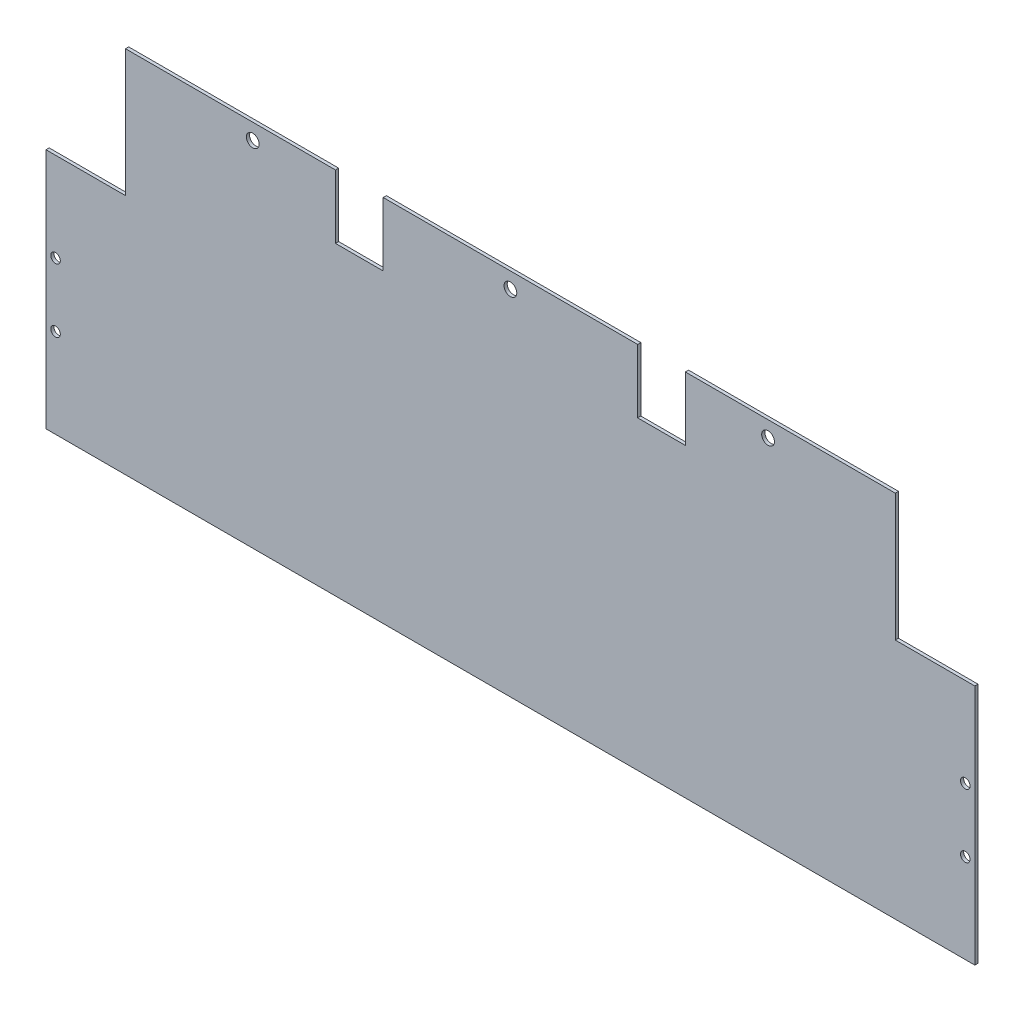
ISO-10303-21;
HEADER;
FILE_DESCRIPTION(('STEP AP214'),'2;1');
FILE_NAME('part.step','',(''),(''),'','','');
FILE_SCHEMA(('AUTOMOTIVE_DESIGN { 1 0 10303 214 1 1 1 1 }'));
ENDSEC;
DATA;
#1=APPLICATION_CONTEXT('core data for automotive mechanical design processes');
#2=APPLICATION_PROTOCOL_DEFINITION('international standard','automotive_design',2000,#1);
#3=PRODUCT_CONTEXT('',#1,'mechanical');
#4=PRODUCT('Part','Part','',(#3));
#5=PRODUCT_RELATED_PRODUCT_CATEGORY('part','',(#4));
#6=PRODUCT_DEFINITION_FORMATION('','',#4);
#7=PRODUCT_DEFINITION_CONTEXT('part definition',#1,'design');
#8=PRODUCT_DEFINITION('design','',#6,#7);
#9=PRODUCT_DEFINITION_SHAPE('','',#8);
#10=(LENGTH_UNIT() NAMED_UNIT(*) SI_UNIT(.MILLI.,.METRE.));
#11=(NAMED_UNIT(*) PLANE_ANGLE_UNIT() SI_UNIT($,.RADIAN.));
#12=(NAMED_UNIT(*) SI_UNIT($,.STERADIAN.) SOLID_ANGLE_UNIT());
#13=UNCERTAINTY_MEASURE_WITH_UNIT(LENGTH_MEASURE(1.E-05),#10,'distance_accuracy_value','');
#14=(GEOMETRIC_REPRESENTATION_CONTEXT(3) GLOBAL_UNCERTAINTY_ASSIGNED_CONTEXT((#13)) GLOBAL_UNIT_ASSIGNED_CONTEXT((#10,
#11,#12)) REPRESENTATION_CONTEXT('',''));
#15=CARTESIAN_POINT('',(0.,0.,0.));
#16=DIRECTION('',(0.,0.,1.));
#17=DIRECTION('',(1.,0.,0.));
#18=AXIS2_PLACEMENT_3D('',#15,#16,#17);
#19=CARTESIAN_POINT('',(25.,116.,1.));
#20=DIRECTION('',(0.,-1.,0.));
#21=DIRECTION('',(0.,0.,-1.));
#22=AXIS2_PLACEMENT_3D('',#19,#20,#21);
#23=PLANE('',#22);
#24=DIRECTION('',(-1.,0.,0.));
#25=VECTOR('',#24,1.);
#26=CARTESIAN_POINT('',(25.,116.,0.));
#27=LINE('',#26,#25);
#28=CARTESIAN_POINT('',(267.,116.,0.));
#29=VERTEX_POINT('',#28);
#30=CARTESIAN_POINT('',(201.,116.,0.));
#31=VERTEX_POINT('',#30);
#32=EDGE_CURVE('E274',#29,#31,#27,.T.);
#33=ORIENTED_EDGE('',*,*,#32,.T.);
#34=DIRECTION('',(0.,0.,1.));
#35=VECTOR('',#34,1.);
#36=CARTESIAN_POINT('',(201.,116.,0.));
#37=LINE('',#36,#35);
#38=CARTESIAN_POINT('',(201.,116.,1.));
#39=VERTEX_POINT('',#38);
#40=EDGE_CURVE('E184',#31,#39,#37,.T.);
#41=ORIENTED_EDGE('',*,*,#40,.T.);
#42=DIRECTION('',(-1.,0.,0.));
#43=VECTOR('',#42,1.);
#44=CARTESIAN_POINT('',(25.,116.,1.));
#45=LINE('',#44,#43);
#46=CARTESIAN_POINT('',(267.,116.,1.));
#47=VERTEX_POINT('',#46);
#48=EDGE_CURVE('E254',#47,#39,#45,.T.);
#49=ORIENTED_EDGE('',*,*,#48,.F.);
#50=DIRECTION('',(0.,0.,-1.));
#51=VECTOR('',#50,1.);
#52=CARTESIAN_POINT('',(267.,116.,1.));
#53=LINE('',#52,#51);
#54=EDGE_CURVE('E293',#47,#29,#53,.T.);
#55=ORIENTED_EDGE('',*,*,#54,.T.);
#56=EDGE_LOOP('',(#33,#41,#49,#55));
#57=FACE_BOUND('',#56,.T.);
#58=ADVANCED_FACE('F36',(#57),#23,.F.);
#59=CARTESIAN_POINT('',(91.,116.,1.));
#60=VERTEX_POINT('',#59);
#61=CARTESIAN_POINT('',(25.,116.,1.));
#62=VERTEX_POINT('',#61);
#63=EDGE_CURVE('E253',#60,#62,#45,.T.);
#64=ORIENTED_EDGE('',*,*,#63,.F.);
#65=DIRECTION('',(0.,0.,1.));
#66=VECTOR('',#65,1.);
#67=CARTESIAN_POINT('',(91.,116.,0.));
#68=LINE('',#67,#66);
#69=CARTESIAN_POINT('',(91.,116.,0.));
#70=VERTEX_POINT('',#69);
#71=EDGE_CURVE('E211',#70,#60,#68,.T.);
#72=ORIENTED_EDGE('',*,*,#71,.F.);
#73=CARTESIAN_POINT('',(25.,116.,0.));
#74=VERTEX_POINT('',#73);
#75=EDGE_CURVE('E273',#70,#74,#27,.T.);
#76=ORIENTED_EDGE('',*,*,#75,.T.);
#77=DIRECTION('',(0.,0.,-1.));
#78=VECTOR('',#77,1.);
#79=CARTESIAN_POINT('',(25.,116.,1.));
#80=LINE('',#79,#78);
#81=EDGE_CURVE('E290',#62,#74,#80,.T.);
#82=ORIENTED_EDGE('',*,*,#81,.F.);
#83=EDGE_LOOP('',(#64,#72,#76,#82));
#84=FACE_BOUND('',#83,.T.);
#85=ADVANCED_FACE('F349',(#84),#23,.F.);
#86=CARTESIAN_POINT('',(0.,0.,1.));
#87=DIRECTION('',(0.,0.,-1.));
#88=DIRECTION('',(-1.,0.,0.));
#89=AXIS2_PLACEMENT_3D('',#86,#87,#88);
#90=PLANE('',#89);
#91=CARTESIAN_POINT('',(65.,111.,1.));
#92=DIRECTION('',(0.,0.,1.));
#93=DIRECTION('',(1.,0.,0.));
#94=AXIS2_PLACEMENT_3D('',#91,#92,#93);
#95=CIRCLE('',#94,2.);
#96=CARTESIAN_POINT('',(67.,111.,1.));
#97=VERTEX_POINT('',#96);
#98=EDGE_CURVE('E192',#97,#97,#95,.T.);
#99=ORIENTED_EDGE('',*,*,#98,.F.);
#100=EDGE_LOOP('',(#99));
#101=FACE_BOUND('',#100,.T.);
#102=CARTESIAN_POINT('',(227.,111.,1.));
#103=DIRECTION('',(0.,0.,1.));
#104=DIRECTION('',(-1.,0.,0.));
#105=AXIS2_PLACEMENT_3D('',#102,#103,#104);
#106=CIRCLE('',#105,2.);
#107=CARTESIAN_POINT('',(225.,111.,1.));
#108=VERTEX_POINT('',#107);
#109=EDGE_CURVE('E575',#108,#108,#106,.T.);
#110=ORIENTED_EDGE('',*,*,#109,.F.);
#111=EDGE_LOOP('',(#110));
#112=FACE_BOUND('',#111,.T.);
#113=CARTESIAN_POINT('',(146.,111.,1.));
#114=DIRECTION('',(0.,0.,1.));
#115=DIRECTION('',(1.,0.,0.));
#116=AXIS2_PLACEMENT_3D('',#113,#114,#115);
#117=CIRCLE('',#116,2.);
#118=CARTESIAN_POINT('',(148.,111.,1.));
#119=VERTEX_POINT('',#118);
#120=EDGE_CURVE('E177',#119,#119,#117,.T.);
#121=ORIENTED_EDGE('',*,*,#120,.F.);
#122=EDGE_LOOP('',(#121));
#123=FACE_BOUND('',#122,.T.);
#124=ORIENTED_EDGE('',*,*,#48,.T.);
#125=DIRECTION('',(0.,1.,0.));
#126=VECTOR('',#125,1.);
#127=CARTESIAN_POINT('',(201.,116.,1.));
#128=LINE('',#127,#126);
#129=CARTESIAN_POINT('',(201.,96.,1.));
#130=VERTEX_POINT('',#129);
#131=EDGE_CURVE('E172',#130,#39,#128,.T.);
#132=ORIENTED_EDGE('',*,*,#131,.F.);
#133=DIRECTION('',(1.,0.,0.));
#134=VECTOR('',#133,1.);
#135=CARTESIAN_POINT('',(201.,96.,1.));
#136=LINE('',#135,#134);
#137=CARTESIAN_POINT('',(186.,96.,1.));
#138=VERTEX_POINT('',#137);
#139=EDGE_CURVE('E174',#138,#130,#136,.T.);
#140=ORIENTED_EDGE('',*,*,#139,.F.);
#141=DIRECTION('',(0.,-1.,0.));
#142=VECTOR('',#141,1.);
#143=CARTESIAN_POINT('',(186.,116.,1.));
#144=LINE('',#143,#142);
#145=CARTESIAN_POINT('',(186.,116.,1.));
#146=VERTEX_POINT('',#145);
#147=EDGE_CURVE('E151',#146,#138,#144,.T.);
#148=ORIENTED_EDGE('',*,*,#147,.F.);
#149=CARTESIAN_POINT('',(106.,116.,1.));
#150=VERTEX_POINT('',#149);
#151=EDGE_CURVE('E258',#146,#150,#45,.T.);
#152=ORIENTED_EDGE('',*,*,#151,.T.);
#153=DIRECTION('',(0.,1.,0.));
#154=VECTOR('',#153,1.);
#155=CARTESIAN_POINT('',(106.,116.,1.));
#156=LINE('',#155,#154);
#157=CARTESIAN_POINT('',(106.,96.,1.));
#158=VERTEX_POINT('',#157);
#159=EDGE_CURVE('E51',#158,#150,#156,.T.);
#160=ORIENTED_EDGE('',*,*,#159,.F.);
#161=DIRECTION('',(1.,0.,0.));
#162=VECTOR('',#161,1.);
#163=CARTESIAN_POINT('',(91.,96.,1.));
#164=LINE('',#163,#162);
#165=CARTESIAN_POINT('',(91.,96.,1.));
#166=VERTEX_POINT('',#165);
#167=EDGE_CURVE('E207',#166,#158,#164,.T.);
#168=ORIENTED_EDGE('',*,*,#167,.F.);
#169=DIRECTION('',(0.,-1.,0.));
#170=VECTOR('',#169,1.);
#171=CARTESIAN_POINT('',(91.,116.,1.));
#172=LINE('',#171,#170);
#173=EDGE_CURVE('E187',#60,#166,#172,.T.);
#174=ORIENTED_EDGE('',*,*,#173,.F.);
#175=ORIENTED_EDGE('',*,*,#63,.T.);
#176=DIRECTION('',(0.,-1.,0.));
#177=VECTOR('',#176,1.);
#178=CARTESIAN_POINT('',(25.,76.,1.));
#179=LINE('',#178,#177);
#180=CARTESIAN_POINT('',(25.,76.,1.));
#181=VERTEX_POINT('',#180);
#182=EDGE_CURVE('E257',#62,#181,#179,.T.);
#183=ORIENTED_EDGE('',*,*,#182,.T.);
#184=DIRECTION('',(-1.,0.,0.));
#185=VECTOR('',#184,1.);
#186=CARTESIAN_POINT('',(0.,76.,1.));
#187=LINE('',#186,#185);
#188=CARTESIAN_POINT('',(0.,76.,1.));
#189=VERTEX_POINT('',#188);
#190=EDGE_CURVE('E260',#181,#189,#187,.T.);
#191=ORIENTED_EDGE('',*,*,#190,.T.);
#192=DIRECTION('',(0.,-1.,0.));
#193=VECTOR('',#192,1.);
#194=CARTESIAN_POINT('',(0.,0.,1.));
#195=LINE('',#194,#193);
#196=CARTESIAN_POINT('',(0.,0.,1.));
#197=VERTEX_POINT('',#196);
#198=EDGE_CURVE('E262',#189,#197,#195,.T.);
#199=ORIENTED_EDGE('',*,*,#198,.T.);
#200=DIRECTION('',(1.,0.,0.));
#201=VECTOR('',#200,1.);
#202=CARTESIAN_POINT('',(292.,0.,1.));
#203=LINE('',#202,#201);
#204=CARTESIAN_POINT('',(292.,0.,1.));
#205=VERTEX_POINT('',#204);
#206=EDGE_CURVE('E243',#197,#205,#203,.T.);
#207=ORIENTED_EDGE('',*,*,#206,.T.);
#208=DIRECTION('',(0.,1.,0.));
#209=VECTOR('',#208,1.);
#210=CARTESIAN_POINT('',(292.,76.,1.));
#211=LINE('',#210,#209);
#212=CARTESIAN_POINT('',(292.,76.,1.));
#213=VERTEX_POINT('',#212);
#214=EDGE_CURVE('E246',#205,#213,#211,.T.);
#215=ORIENTED_EDGE('',*,*,#214,.T.);
#216=DIRECTION('',(-1.,0.,0.));
#217=VECTOR('',#216,1.);
#218=CARTESIAN_POINT('',(267.,76.,1.));
#219=LINE('',#218,#217);
#220=CARTESIAN_POINT('',(267.,76.,1.));
#221=VERTEX_POINT('',#220);
#222=EDGE_CURVE('E249',#213,#221,#219,.T.);
#223=ORIENTED_EDGE('',*,*,#222,.T.);
#224=DIRECTION('',(0.,1.,0.));
#225=VECTOR('',#224,1.);
#226=CARTESIAN_POINT('',(267.,116.,1.));
#227=LINE('',#226,#225);
#228=EDGE_CURVE('E251',#221,#47,#227,.T.);
#229=ORIENTED_EDGE('',*,*,#228,.T.);
#230=EDGE_LOOP('',(#124,#132,#140,#148,#152,#160,#168,#174,#175,#183,#191,#199,#207,#215,#223,#229));
#231=FACE_BOUND('',#230,.T.);
#232=CARTESIAN_POINT('',(3.,48.,1.));
#233=DIRECTION('',(0.,0.,1.));
#234=DIRECTION('',(1.,0.,0.));
#235=AXIS2_PLACEMENT_3D('',#232,#233,#234);
#236=CIRCLE('',#235,1.5);
#237=CARTESIAN_POINT('',(4.5,48.,1.));
#238=VERTEX_POINT('',#237);
#239=EDGE_CURVE('E237',#238,#238,#236,.T.);
#240=ORIENTED_EDGE('',*,*,#239,.F.);
#241=EDGE_LOOP('',(#240));
#242=FACE_BOUND('',#241,.T.);
#243=CARTESIAN_POINT('',(3.,28.,1.));
#244=DIRECTION('',(0.,0.,1.));
#245=DIRECTION('',(1.,0.,0.));
#246=AXIS2_PLACEMENT_3D('',#243,#244,#245);
#247=CIRCLE('',#246,1.5);
#248=CARTESIAN_POINT('',(4.5,28.,1.));
#249=VERTEX_POINT('',#248);
#250=EDGE_CURVE('E231',#249,#249,#247,.T.);
#251=ORIENTED_EDGE('',*,*,#250,.F.);
#252=EDGE_LOOP('',(#251));
#253=FACE_BOUND('',#252,.T.);
#254=CARTESIAN_POINT('',(289.,28.,1.));
#255=DIRECTION('',(0.,0.,1.));
#256=DIRECTION('',(-1.,0.,0.));
#257=AXIS2_PLACEMENT_3D('',#254,#255,#256);
#258=CIRCLE('',#257,1.49999999999997);
#259=CARTESIAN_POINT('',(287.5,28.,1.));
#260=VERTEX_POINT('',#259);
#261=EDGE_CURVE('E225',#260,#260,#258,.T.);
#262=ORIENTED_EDGE('',*,*,#261,.F.);
#263=EDGE_LOOP('',(#262));
#264=FACE_BOUND('',#263,.T.);
#265=CARTESIAN_POINT('',(289.,48.,1.));
#266=DIRECTION('',(0.,0.,1.));
#267=DIRECTION('',(-1.,0.,0.));
#268=AXIS2_PLACEMENT_3D('',#265,#266,#267);
#269=CIRCLE('',#268,1.49999999999997);
#270=CARTESIAN_POINT('',(287.5,48.,1.));
#271=VERTEX_POINT('',#270);
#272=EDGE_CURVE('E219',#271,#271,#269,.T.);
#273=ORIENTED_EDGE('',*,*,#272,.F.);
#274=EDGE_LOOP('',(#273));
#275=FACE_BOUND('',#274,.T.);
#276=ADVANCED_FACE('F317',(#101,#112,#123,#231,#242,#253,#264,#275),#90,.F.);
#277=CARTESIAN_POINT('',(0.,0.,0.));
#278=DIRECTION('',(0.,0.,-1.));
#279=DIRECTION('',(-1.,0.,0.));
#280=AXIS2_PLACEMENT_3D('',#277,#278,#279);
#281=PLANE('',#280);
#282=DIRECTION('',(0.,1.,0.));
#283=VECTOR('',#282,1.);
#284=CARTESIAN_POINT('',(201.,116.,0.));
#285=LINE('',#284,#283);
#286=CARTESIAN_POINT('',(201.,96.,0.));
#287=VERTEX_POINT('',#286);
#288=EDGE_CURVE('E164',#287,#31,#285,.T.);
#289=ORIENTED_EDGE('',*,*,#288,.T.);
#290=ORIENTED_EDGE('',*,*,#32,.F.);
#291=DIRECTION('',(0.,1.,0.));
#292=VECTOR('',#291,1.);
#293=CARTESIAN_POINT('',(267.,116.,0.));
#294=LINE('',#293,#292);
#295=CARTESIAN_POINT('',(267.,76.,0.));
#296=VERTEX_POINT('',#295);
#297=EDGE_CURVE('E271',#296,#29,#294,.T.);
#298=ORIENTED_EDGE('',*,*,#297,.F.);
#299=DIRECTION('',(-1.,0.,0.));
#300=VECTOR('',#299,1.);
#301=CARTESIAN_POINT('',(267.,76.,0.));
#302=LINE('',#301,#300);
#303=CARTESIAN_POINT('',(292.,76.,0.));
#304=VERTEX_POINT('',#303);
#305=EDGE_CURVE('E269',#304,#296,#302,.T.);
#306=ORIENTED_EDGE('',*,*,#305,.F.);
#307=DIRECTION('',(0.,1.,0.));
#308=VECTOR('',#307,1.);
#309=CARTESIAN_POINT('',(292.,76.,0.));
#310=LINE('',#309,#308);
#311=CARTESIAN_POINT('',(292.,0.,0.));
#312=VERTEX_POINT('',#311);
#313=EDGE_CURVE('E267',#312,#304,#310,.T.);
#314=ORIENTED_EDGE('',*,*,#313,.F.);
#315=DIRECTION('',(1.,0.,0.));
#316=VECTOR('',#315,1.);
#317=CARTESIAN_POINT('',(292.,0.,0.));
#318=LINE('',#317,#316);
#319=CARTESIAN_POINT('',(0.,0.,0.));
#320=VERTEX_POINT('',#319);
#321=EDGE_CURVE('E240',#320,#312,#318,.T.);
#322=ORIENTED_EDGE('',*,*,#321,.F.);
#323=DIRECTION('',(0.,-1.,0.));
#324=VECTOR('',#323,1.);
#325=CARTESIAN_POINT('',(0.,0.,0.));
#326=LINE('',#325,#324);
#327=CARTESIAN_POINT('',(0.,76.,0.));
#328=VERTEX_POINT('',#327);
#329=EDGE_CURVE('E247',#328,#320,#326,.T.);
#330=ORIENTED_EDGE('',*,*,#329,.F.);
#331=DIRECTION('',(-1.,0.,0.));
#332=VECTOR('',#331,1.);
#333=CARTESIAN_POINT('',(0.,76.,0.));
#334=LINE('',#333,#332);
#335=CARTESIAN_POINT('',(25.,76.,0.));
#336=VERTEX_POINT('',#335);
#337=EDGE_CURVE('E279',#336,#328,#334,.T.);
#338=ORIENTED_EDGE('',*,*,#337,.F.);
#339=DIRECTION('',(0.,-1.,0.));
#340=VECTOR('',#339,1.);
#341=CARTESIAN_POINT('',(25.,76.,0.));
#342=LINE('',#341,#340);
#343=EDGE_CURVE('E277',#74,#336,#342,.T.);
#344=ORIENTED_EDGE('',*,*,#343,.F.);
#345=ORIENTED_EDGE('',*,*,#75,.F.);
#346=DIRECTION('',(0.,-1.,0.));
#347=VECTOR('',#346,1.);
#348=CARTESIAN_POINT('',(91.,116.,0.));
#349=LINE('',#348,#347);
#350=CARTESIAN_POINT('',(91.,96.,0.));
#351=VERTEX_POINT('',#350);
#352=EDGE_CURVE('E196',#70,#351,#349,.T.);
#353=ORIENTED_EDGE('',*,*,#352,.T.);
#354=DIRECTION('',(1.,0.,0.));
#355=VECTOR('',#354,1.);
#356=CARTESIAN_POINT('',(91.,96.,0.));
#357=LINE('',#356,#355);
#358=CARTESIAN_POINT('',(106.,96.,0.));
#359=VERTEX_POINT('',#358);
#360=EDGE_CURVE('E199',#351,#359,#357,.T.);
#361=ORIENTED_EDGE('',*,*,#360,.T.);
#362=DIRECTION('',(0.,1.,0.));
#363=VECTOR('',#362,1.);
#364=CARTESIAN_POINT('',(106.,116.,0.));
#365=LINE('',#364,#363);
#366=CARTESIAN_POINT('',(106.,116.,0.));
#367=VERTEX_POINT('',#366);
#368=EDGE_CURVE('E202',#359,#367,#365,.T.);
#369=ORIENTED_EDGE('',*,*,#368,.T.);
#370=CARTESIAN_POINT('',(186.,116.,0.));
#371=VERTEX_POINT('',#370);
#372=EDGE_CURVE('E171',#371,#367,#27,.T.);
#373=ORIENTED_EDGE('',*,*,#372,.F.);
#374=DIRECTION('',(0.,-1.,0.));
#375=VECTOR('',#374,1.);
#376=CARTESIAN_POINT('',(186.,116.,0.));
#377=LINE('',#376,#375);
#378=CARTESIAN_POINT('',(186.,96.,0.));
#379=VERTEX_POINT('',#378);
#380=EDGE_CURVE('E59',#371,#379,#377,.T.);
#381=ORIENTED_EDGE('',*,*,#380,.T.);
#382=DIRECTION('',(1.,0.,0.));
#383=VECTOR('',#382,1.);
#384=CARTESIAN_POINT('',(201.,96.,0.));
#385=LINE('',#384,#383);
#386=EDGE_CURVE('E159',#379,#287,#385,.T.);
#387=ORIENTED_EDGE('',*,*,#386,.T.);
#388=EDGE_LOOP('',(#289,#290,#298,#306,#314,#322,#330,#338,#344,#345,#353,#361,#369,#373,#381,#387));
#389=FACE_BOUND('',#388,.T.);
#390=CARTESIAN_POINT('',(65.,111.,0.));
#391=DIRECTION('',(0.,0.,1.));
#392=DIRECTION('',(1.,0.,0.));
#393=AXIS2_PLACEMENT_3D('',#390,#391,#392);
#394=CIRCLE('',#393,2.);
#395=CARTESIAN_POINT('',(67.,111.,0.));
#396=VERTEX_POINT('',#395);
#397=EDGE_CURVE('E182',#396,#396,#394,.T.);
#398=ORIENTED_EDGE('',*,*,#397,.T.);
#399=EDGE_LOOP('',(#398));
#400=FACE_BOUND('',#399,.T.);
#401=CARTESIAN_POINT('',(227.,111.,0.));
#402=DIRECTION('',(0.,0.,1.));
#403=DIRECTION('',(-1.,0.,0.));
#404=AXIS2_PLACEMENT_3D('',#401,#402,#403);
#405=CIRCLE('',#404,2.);
#406=CARTESIAN_POINT('',(225.,111.,0.));
#407=VERTEX_POINT('',#406);
#408=EDGE_CURVE('E195',#407,#407,#405,.T.);
#409=ORIENTED_EDGE('',*,*,#408,.T.);
#410=EDGE_LOOP('',(#409));
#411=FACE_BOUND('',#410,.T.);
#412=CARTESIAN_POINT('',(146.,111.,0.));
#413=DIRECTION('',(0.,0.,1.));
#414=DIRECTION('',(1.,0.,0.));
#415=AXIS2_PLACEMENT_3D('',#412,#413,#414);
#416=CIRCLE('',#415,2.);
#417=CARTESIAN_POINT('',(148.,111.,0.));
#418=VERTEX_POINT('',#417);
#419=EDGE_CURVE('E579',#418,#418,#416,.T.);
#420=ORIENTED_EDGE('',*,*,#419,.T.);
#421=EDGE_LOOP('',(#420));
#422=FACE_BOUND('',#421,.T.);
#423=CARTESIAN_POINT('',(289.,28.,0.));
#424=DIRECTION('',(0.,0.,1.));
#425=DIRECTION('',(-1.,0.,0.));
#426=AXIS2_PLACEMENT_3D('',#423,#424,#425);
#427=CIRCLE('',#426,1.49999999999997);
#428=CARTESIAN_POINT('',(287.5,28.,0.));
#429=VERTEX_POINT('',#428);
#430=EDGE_CURVE('E222',#429,#429,#427,.T.);
#431=ORIENTED_EDGE('',*,*,#430,.T.);
#432=EDGE_LOOP('',(#431));
#433=FACE_BOUND('',#432,.T.);
#434=CARTESIAN_POINT('',(3.,48.,0.));
#435=DIRECTION('',(0.,0.,1.));
#436=DIRECTION('',(1.,0.,0.));
#437=AXIS2_PLACEMENT_3D('',#434,#435,#436);
#438=CIRCLE('',#437,1.5);
#439=CARTESIAN_POINT('',(4.5,48.,0.));
#440=VERTEX_POINT('',#439);
#441=EDGE_CURVE('E234',#440,#440,#438,.T.);
#442=ORIENTED_EDGE('',*,*,#441,.T.);
#443=EDGE_LOOP('',(#442));
#444=FACE_BOUND('',#443,.T.);
#445=CARTESIAN_POINT('',(3.,28.,0.));
#446=DIRECTION('',(0.,0.,1.));
#447=DIRECTION('',(1.,0.,0.));
#448=AXIS2_PLACEMENT_3D('',#445,#446,#447);
#449=CIRCLE('',#448,1.5);
#450=CARTESIAN_POINT('',(4.5,28.,0.));
#451=VERTEX_POINT('',#450);
#452=EDGE_CURVE('E228',#451,#451,#449,.T.);
#453=ORIENTED_EDGE('',*,*,#452,.T.);
#454=EDGE_LOOP('',(#453));
#455=FACE_BOUND('',#454,.T.);
#456=CARTESIAN_POINT('',(289.,48.,0.));
#457=DIRECTION('',(0.,0.,1.));
#458=DIRECTION('',(-1.,0.,0.));
#459=AXIS2_PLACEMENT_3D('',#456,#457,#458);
#460=CIRCLE('',#459,1.49999999999997);
#461=CARTESIAN_POINT('',(287.5,48.,0.));
#462=VERTEX_POINT('',#461);
#463=EDGE_CURVE('E213',#462,#462,#460,.T.);
#464=ORIENTED_EDGE('',*,*,#463,.T.);
#465=EDGE_LOOP('',(#464));
#466=FACE_BOUND('',#465,.T.);
#467=ADVANCED_FACE('F167',(#389,#400,#411,#422,#433,#444,#455,#466),#281,.T.);
#468=CARTESIAN_POINT('',(292.,0.,1.));
#469=DIRECTION('',(0.,1.,0.));
#470=DIRECTION('',(0.,0.,1.));
#471=AXIS2_PLACEMENT_3D('',#468,#469,#470);
#472=PLANE('',#471);
#473=ORIENTED_EDGE('',*,*,#321,.T.);
#474=DIRECTION('',(0.,0.,-1.));
#475=VECTOR('',#474,1.);
#476=CARTESIAN_POINT('',(292.,0.,1.));
#477=LINE('',#476,#475);
#478=EDGE_CURVE('E11',#205,#312,#477,.T.);
#479=ORIENTED_EDGE('',*,*,#478,.F.);
#480=ORIENTED_EDGE('',*,*,#206,.F.);
#481=DIRECTION('',(0.,0.,-1.));
#482=VECTOR('',#481,1.);
#483=CARTESIAN_POINT('',(0.,0.,1.));
#484=LINE('',#483,#482);
#485=EDGE_CURVE('E264',#197,#320,#484,.T.);
#486=ORIENTED_EDGE('',*,*,#485,.T.);
#487=EDGE_LOOP('',(#473,#479,#480,#486));
#488=FACE_BOUND('',#487,.T.);
#489=ADVANCED_FACE('F38',(#488),#472,.F.);
#490=CARTESIAN_POINT('',(292.,76.,1.));
#491=DIRECTION('',(-1.,0.,0.));
#492=DIRECTION('',(0.,0.,1.));
#493=AXIS2_PLACEMENT_3D('',#490,#491,#492);
#494=PLANE('',#493);
#495=ORIENTED_EDGE('',*,*,#313,.T.);
#496=DIRECTION('',(0.,0.,-1.));
#497=VECTOR('',#496,1.);
#498=CARTESIAN_POINT('',(292.,76.,1.));
#499=LINE('',#498,#497);
#500=EDGE_CURVE('E44',#213,#304,#499,.T.);
#501=ORIENTED_EDGE('',*,*,#500,.F.);
#502=ORIENTED_EDGE('',*,*,#214,.F.);
#503=ORIENTED_EDGE('',*,*,#478,.T.);
#504=EDGE_LOOP('',(#495,#501,#502,#503));
#505=FACE_BOUND('',#504,.T.);
#506=ADVANCED_FACE('F321',(#505),#494,.F.);
#507=CARTESIAN_POINT('',(267.,76.,1.));
#508=DIRECTION('',(0.,-1.,0.));
#509=DIRECTION('',(1.,0.,0.));
#510=AXIS2_PLACEMENT_3D('',#507,#508,#509);
#511=PLANE('',#510);
#512=ORIENTED_EDGE('',*,*,#305,.T.);
#513=DIRECTION('',(0.,0.,-1.));
#514=VECTOR('',#513,1.);
#515=CARTESIAN_POINT('',(267.,76.,1.));
#516=LINE('',#515,#514);
#517=EDGE_CURVE('E296',#221,#296,#516,.T.);
#518=ORIENTED_EDGE('',*,*,#517,.F.);
#519=ORIENTED_EDGE('',*,*,#222,.F.);
#520=ORIENTED_EDGE('',*,*,#500,.T.);
#521=EDGE_LOOP('',(#512,#518,#519,#520));
#522=FACE_BOUND('',#521,.T.);
#523=ADVANCED_FACE('F303',(#522),#511,.F.);
#524=CARTESIAN_POINT('',(267.,116.,1.));
#525=DIRECTION('',(-1.,0.,0.));
#526=DIRECTION('',(0.,0.,1.));
#527=AXIS2_PLACEMENT_3D('',#524,#525,#526);
#528=PLANE('',#527);
#529=ORIENTED_EDGE('',*,*,#297,.T.);
#530=ORIENTED_EDGE('',*,*,#54,.F.);
#531=ORIENTED_EDGE('',*,*,#228,.F.);
#532=ORIENTED_EDGE('',*,*,#517,.T.);
#533=EDGE_LOOP('',(#529,#530,#531,#532));
#534=FACE_BOUND('',#533,.T.);
#535=ADVANCED_FACE('F311',(#534),#528,.F.);
#536=ORIENTED_EDGE('',*,*,#151,.F.);
#537=DIRECTION('',(0.,0.,1.));
#538=VECTOR('',#537,1.);
#539=CARTESIAN_POINT('',(186.,116.,0.));
#540=LINE('',#539,#538);
#541=EDGE_CURVE('E156',#371,#146,#540,.T.);
#542=ORIENTED_EDGE('',*,*,#541,.F.);
#543=ORIENTED_EDGE('',*,*,#372,.T.);
#544=DIRECTION('',(0.,0.,1.));
#545=VECTOR('',#544,1.);
#546=CARTESIAN_POINT('',(106.,116.,0.));
#547=LINE('',#546,#545);
#548=EDGE_CURVE('E214',#367,#150,#547,.T.);
#549=ORIENTED_EDGE('',*,*,#548,.T.);
#550=EDGE_LOOP('',(#536,#542,#543,#549));
#551=FACE_BOUND('',#550,.T.);
#552=ADVANCED_FACE('F344',(#551),#23,.F.);
#553=CARTESIAN_POINT('',(25.,76.,1.));
#554=DIRECTION('',(1.,0.,0.));
#555=DIRECTION('',(0.,0.,-1.));
#556=AXIS2_PLACEMENT_3D('',#553,#554,#555);
#557=PLANE('',#556);
#558=ORIENTED_EDGE('',*,*,#343,.T.);
#559=DIRECTION('',(0.,0.,-1.));
#560=VECTOR('',#559,1.);
#561=CARTESIAN_POINT('',(25.,76.,1.));
#562=LINE('',#561,#560);
#563=EDGE_CURVE('E287',#181,#336,#562,.T.);
#564=ORIENTED_EDGE('',*,*,#563,.F.);
#565=ORIENTED_EDGE('',*,*,#182,.F.);
#566=ORIENTED_EDGE('',*,*,#81,.T.);
#567=EDGE_LOOP('',(#558,#564,#565,#566));
#568=FACE_BOUND('',#567,.T.);
#569=ADVANCED_FACE('F337',(#568),#557,.F.);
#570=CARTESIAN_POINT('',(0.,76.,1.));
#571=DIRECTION('',(0.,-1.,0.));
#572=DIRECTION('',(1.,0.,0.));
#573=AXIS2_PLACEMENT_3D('',#570,#571,#572);
#574=PLANE('',#573);
#575=ORIENTED_EDGE('',*,*,#337,.T.);
#576=DIRECTION('',(0.,0.,-1.));
#577=VECTOR('',#576,1.);
#578=CARTESIAN_POINT('',(0.,76.,1.));
#579=LINE('',#578,#577);
#580=EDGE_CURVE('E284',#189,#328,#579,.T.);
#581=ORIENTED_EDGE('',*,*,#580,.F.);
#582=ORIENTED_EDGE('',*,*,#190,.F.);
#583=ORIENTED_EDGE('',*,*,#563,.T.);
#584=EDGE_LOOP('',(#575,#581,#582,#583));
#585=FACE_BOUND('',#584,.T.);
#586=ADVANCED_FACE('F333',(#585),#574,.F.);
#587=CARTESIAN_POINT('',(0.,0.,1.));
#588=DIRECTION('',(1.,0.,0.));
#589=DIRECTION('',(0.,0.,-1.));
#590=AXIS2_PLACEMENT_3D('',#587,#588,#589);
#591=PLANE('',#590);
#592=ORIENTED_EDGE('',*,*,#329,.T.);
#593=ORIENTED_EDGE('',*,*,#485,.F.);
#594=ORIENTED_EDGE('',*,*,#198,.F.);
#595=ORIENTED_EDGE('',*,*,#580,.T.);
#596=EDGE_LOOP('',(#592,#593,#594,#595));
#597=FACE_BOUND('',#596,.T.);
#598=ADVANCED_FACE('F328',(#597),#591,.F.);
#599=CARTESIAN_POINT('',(3.,48.,1.));
#600=DIRECTION('',(0.,0.,-1.));
#601=DIRECTION('',(-1.,0.,0.));
#602=AXIS2_PLACEMENT_3D('',#599,#600,#601);
#603=CYLINDRICAL_SURFACE('',#602,1.5);
#604=ORIENTED_EDGE('',*,*,#239,.T.);
#605=EDGE_LOOP('',(#604));
#606=FACE_BOUND('',#605,.T.);
#607=ORIENTED_EDGE('',*,*,#441,.F.);
#608=EDGE_LOOP('',(#607));
#609=FACE_BOUND('',#608,.T.);
#610=ADVANCED_FACE('F383',(#606,#609),#603,.F.);
#611=CARTESIAN_POINT('',(3.,28.,1.));
#612=DIRECTION('',(0.,0.,-1.));
#613=DIRECTION('',(-1.,0.,0.));
#614=AXIS2_PLACEMENT_3D('',#611,#612,#613);
#615=CYLINDRICAL_SURFACE('',#614,1.5);
#616=ORIENTED_EDGE('',*,*,#250,.T.);
#617=EDGE_LOOP('',(#616));
#618=FACE_BOUND('',#617,.T.);
#619=ORIENTED_EDGE('',*,*,#452,.F.);
#620=EDGE_LOOP('',(#619));
#621=FACE_BOUND('',#620,.T.);
#622=ADVANCED_FACE('F399',(#618,#621),#615,.F.);
#623=CARTESIAN_POINT('',(289.,28.,1.));
#624=DIRECTION('',(0.,0.,-1.));
#625=DIRECTION('',(-1.,0.,0.));
#626=AXIS2_PLACEMENT_3D('',#623,#624,#625);
#627=CYLINDRICAL_SURFACE('',#626,1.49999999999997);
#628=ORIENTED_EDGE('',*,*,#261,.T.);
#629=EDGE_LOOP('',(#628));
#630=FACE_BOUND('',#629,.T.);
#631=ORIENTED_EDGE('',*,*,#430,.F.);
#632=EDGE_LOOP('',(#631));
#633=FACE_BOUND('',#632,.T.);
#634=ADVANCED_FACE('F406',(#630,#633),#627,.F.);
#635=CARTESIAN_POINT('',(289.,48.,1.));
#636=DIRECTION('',(0.,0.,-1.));
#637=DIRECTION('',(-1.,0.,0.));
#638=AXIS2_PLACEMENT_3D('',#635,#636,#637);
#639=CYLINDRICAL_SURFACE('',#638,1.49999999999997);
#640=ORIENTED_EDGE('',*,*,#272,.T.);
#641=EDGE_LOOP('',(#640));
#642=FACE_BOUND('',#641,.T.);
#643=ORIENTED_EDGE('',*,*,#463,.F.);
#644=EDGE_LOOP('',(#643));
#645=FACE_BOUND('',#644,.T.);
#646=ADVANCED_FACE('F414',(#642,#645),#639,.F.);
#647=CARTESIAN_POINT('',(91.,116.,0.));
#648=DIRECTION('',(-1.,0.,0.));
#649=DIRECTION('',(0.,0.,1.));
#650=AXIS2_PLACEMENT_3D('',#647,#648,#649);
#651=PLANE('',#650);
#652=ORIENTED_EDGE('',*,*,#173,.T.);
#653=DIRECTION('',(0.,0.,1.));
#654=VECTOR('',#653,1.);
#655=CARTESIAN_POINT('',(91.,96.,0.));
#656=LINE('',#655,#654);
#657=EDGE_CURVE('E204',#351,#166,#656,.T.);
#658=ORIENTED_EDGE('',*,*,#657,.F.);
#659=ORIENTED_EDGE('',*,*,#352,.F.);
#660=ORIENTED_EDGE('',*,*,#71,.T.);
#661=EDGE_LOOP('',(#652,#658,#659,#660));
#662=FACE_BOUND('',#661,.T.);
#663=ADVANCED_FACE('F422',(#662),#651,.F.);
#664=CARTESIAN_POINT('',(106.,116.,0.));
#665=DIRECTION('',(1.,0.,0.));
#666=DIRECTION('',(0.,1.,0.));
#667=AXIS2_PLACEMENT_3D('',#664,#665,#666);
#668=PLANE('',#667);
#669=ORIENTED_EDGE('',*,*,#159,.T.);
#670=ORIENTED_EDGE('',*,*,#548,.F.);
#671=ORIENTED_EDGE('',*,*,#368,.F.);
#672=DIRECTION('',(0.,0.,1.));
#673=VECTOR('',#672,1.);
#674=CARTESIAN_POINT('',(106.,96.,0.));
#675=LINE('',#674,#673);
#676=EDGE_CURVE('E216',#359,#158,#675,.T.);
#677=ORIENTED_EDGE('',*,*,#676,.T.);
#678=EDGE_LOOP('',(#669,#670,#671,#677));
#679=FACE_BOUND('',#678,.T.);
#680=ADVANCED_FACE('F431',(#679),#668,.F.);
#681=CARTESIAN_POINT('',(91.,96.,0.));
#682=DIRECTION('',(0.,-1.,0.));
#683=DIRECTION('',(0.,0.,-1.));
#684=AXIS2_PLACEMENT_3D('',#681,#682,#683);
#685=PLANE('',#684);
#686=ORIENTED_EDGE('',*,*,#167,.T.);
#687=ORIENTED_EDGE('',*,*,#676,.F.);
#688=ORIENTED_EDGE('',*,*,#360,.F.);
#689=ORIENTED_EDGE('',*,*,#657,.T.);
#690=EDGE_LOOP('',(#686,#687,#688,#689));
#691=FACE_BOUND('',#690,.T.);
#692=ADVANCED_FACE('F439',(#691),#685,.F.);
#693=CARTESIAN_POINT('',(201.,116.,0.));
#694=DIRECTION('',(1.,0.,0.));
#695=DIRECTION('',(0.,1.,0.));
#696=AXIS2_PLACEMENT_3D('',#693,#694,#695);
#697=PLANE('',#696);
#698=ORIENTED_EDGE('',*,*,#131,.T.);
#699=ORIENTED_EDGE('',*,*,#40,.F.);
#700=ORIENTED_EDGE('',*,*,#288,.F.);
#701=DIRECTION('',(0.,0.,1.));
#702=VECTOR('',#701,1.);
#703=CARTESIAN_POINT('',(201.,96.,0.));
#704=LINE('',#703,#702);
#705=EDGE_CURVE('E155',#287,#130,#704,.T.);
#706=ORIENTED_EDGE('',*,*,#705,.T.);
#707=EDGE_LOOP('',(#698,#699,#700,#706));
#708=FACE_BOUND('',#707,.T.);
#709=ADVANCED_FACE('F446',(#708),#697,.F.);
#710=CARTESIAN_POINT('',(201.,96.,0.));
#711=DIRECTION('',(0.,-1.,0.));
#712=DIRECTION('',(0.,0.,-1.));
#713=AXIS2_PLACEMENT_3D('',#710,#711,#712);
#714=PLANE('',#713);
#715=ORIENTED_EDGE('',*,*,#139,.T.);
#716=ORIENTED_EDGE('',*,*,#705,.F.);
#717=ORIENTED_EDGE('',*,*,#386,.F.);
#718=DIRECTION('',(0.,0.,1.));
#719=VECTOR('',#718,1.);
#720=CARTESIAN_POINT('',(186.,96.,0.));
#721=LINE('',#720,#719);
#722=EDGE_CURVE('E147',#379,#138,#721,.T.);
#723=ORIENTED_EDGE('',*,*,#722,.T.);
#724=EDGE_LOOP('',(#715,#716,#717,#723));
#725=FACE_BOUND('',#724,.T.);
#726=ADVANCED_FACE('F160',(#725),#714,.F.);
#727=CARTESIAN_POINT('',(186.,116.,0.));
#728=DIRECTION('',(-1.,0.,0.));
#729=DIRECTION('',(0.,-1.,0.));
#730=AXIS2_PLACEMENT_3D('',#727,#728,#729);
#731=PLANE('',#730);
#732=ORIENTED_EDGE('',*,*,#147,.T.);
#733=ORIENTED_EDGE('',*,*,#722,.F.);
#734=ORIENTED_EDGE('',*,*,#380,.F.);
#735=ORIENTED_EDGE('',*,*,#541,.T.);
#736=EDGE_LOOP('',(#732,#733,#734,#735));
#737=FACE_BOUND('',#736,.T.);
#738=ADVANCED_FACE('F149',(#737),#731,.F.);
#739=CARTESIAN_POINT('',(146.,111.,0.));
#740=DIRECTION('',(0.,0.,1.));
#741=DIRECTION('',(1.,0.,0.));
#742=AXIS2_PLACEMENT_3D('',#739,#740,#741);
#743=CYLINDRICAL_SURFACE('',#742,2.);
#744=ORIENTED_EDGE('',*,*,#419,.F.);
#745=EDGE_LOOP('',(#744));
#746=FACE_BOUND('',#745,.T.);
#747=ORIENTED_EDGE('',*,*,#120,.T.);
#748=EDGE_LOOP('',(#747));
#749=FACE_BOUND('',#748,.T.);
#750=ADVANCED_FACE('F467',(#746,#749),#743,.F.);
#751=CARTESIAN_POINT('',(227.,111.,0.));
#752=DIRECTION('',(0.,0.,1.));
#753=DIRECTION('',(1.,0.,0.));
#754=AXIS2_PLACEMENT_3D('',#751,#752,#753);
#755=CYLINDRICAL_SURFACE('',#754,2.);
#756=ORIENTED_EDGE('',*,*,#408,.F.);
#757=EDGE_LOOP('',(#756));
#758=FACE_BOUND('',#757,.T.);
#759=ORIENTED_EDGE('',*,*,#109,.T.);
#760=EDGE_LOOP('',(#759));
#761=FACE_BOUND('',#760,.T.);
#762=ADVANCED_FACE('F474',(#758,#761),#755,.F.);
#763=CARTESIAN_POINT('',(65.,111.,0.));
#764=DIRECTION('',(0.,0.,1.));
#765=DIRECTION('',(1.,0.,0.));
#766=AXIS2_PLACEMENT_3D('',#763,#764,#765);
#767=CYLINDRICAL_SURFACE('',#766,2.);
#768=ORIENTED_EDGE('',*,*,#397,.F.);
#769=EDGE_LOOP('',(#768));
#770=FACE_BOUND('',#769,.T.);
#771=ORIENTED_EDGE('',*,*,#98,.T.);
#772=EDGE_LOOP('',(#771));
#773=FACE_BOUND('',#772,.T.);
#774=ADVANCED_FACE('F482',(#770,#773),#767,.F.);
#775=CLOSED_SHELL('',(#58,#85,#276,#467,#489,#506,#523,#535,#552,#569,#586,#598,#610,#622,#634,
#646,#663,#680,#692,#709,#726,#738,#750,#762,#774));
#776=MANIFOLD_SOLID_BREP('B2',#775);
#777=ADVANCED_BREP_SHAPE_REPRESENTATION('',(#18,#776),#14);
#778=SHAPE_DEFINITION_REPRESENTATION(#9,#777);
ENDSEC;
END-ISO-10303-21;
